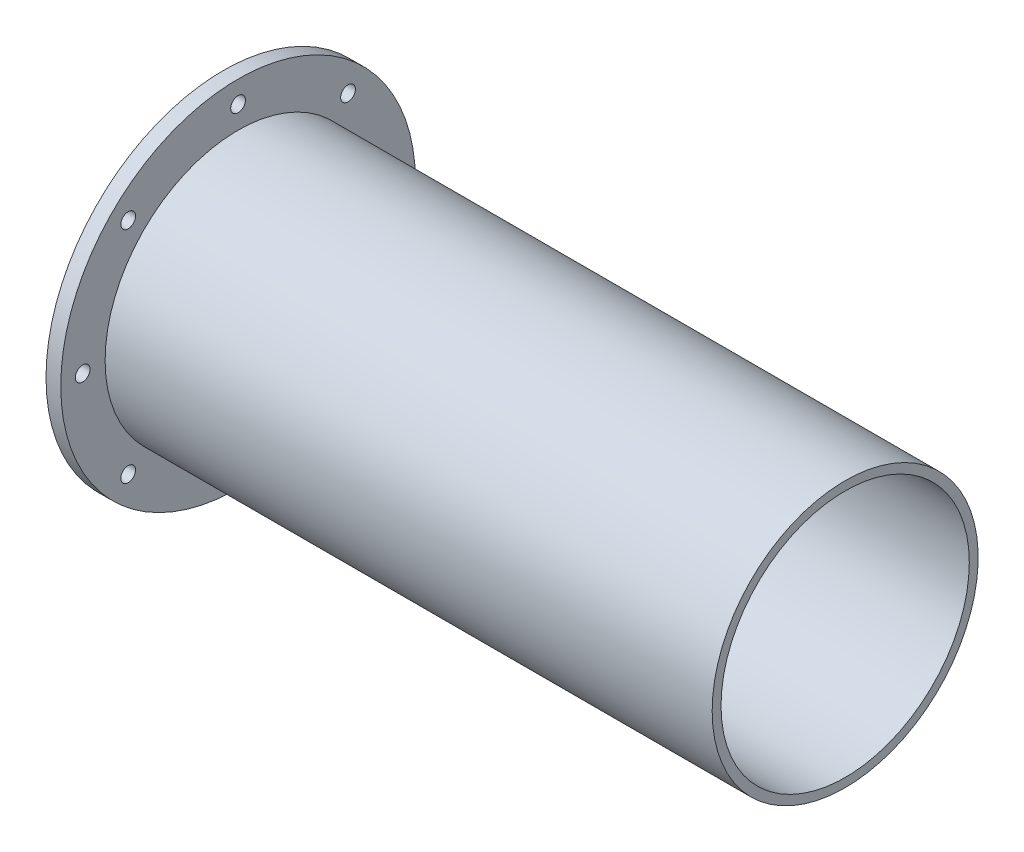
ISO-10303-21;
HEADER;
FILE_DESCRIPTION(('STEP AP214'),'2;1');
FILE_NAME('part.step','',(''),(''),'','','');
FILE_SCHEMA(('AUTOMOTIVE_DESIGN { 1 0 10303 214 1 1 1 1 }'));
ENDSEC;
DATA;
#1=APPLICATION_CONTEXT('core data for automotive mechanical design processes');
#2=APPLICATION_PROTOCOL_DEFINITION('international standard','automotive_design',2000,#1);
#3=PRODUCT_CONTEXT('',#1,'mechanical');
#4=PRODUCT('Part','Part','',(#3));
#5=PRODUCT_RELATED_PRODUCT_CATEGORY('part','',(#4));
#6=PRODUCT_DEFINITION_FORMATION('','',#4);
#7=PRODUCT_DEFINITION_CONTEXT('part definition',#1,'design');
#8=PRODUCT_DEFINITION('design','',#6,#7);
#9=PRODUCT_DEFINITION_SHAPE('','',#8);
#10=(LENGTH_UNIT() NAMED_UNIT(*) SI_UNIT(.MILLI.,.METRE.));
#11=(NAMED_UNIT(*) PLANE_ANGLE_UNIT() SI_UNIT($,.RADIAN.));
#12=(NAMED_UNIT(*) SI_UNIT($,.STERADIAN.) SOLID_ANGLE_UNIT());
#13=UNCERTAINTY_MEASURE_WITH_UNIT(LENGTH_MEASURE(1.E-05),#10,'distance_accuracy_value','');
#14=(GEOMETRIC_REPRESENTATION_CONTEXT(3) GLOBAL_UNCERTAINTY_ASSIGNED_CONTEXT((#13)) GLOBAL_UNIT_ASSIGNED_CONTEXT((#10,
#11,#12)) REPRESENTATION_CONTEXT('',''));
#15=CARTESIAN_POINT('',(0.,0.,0.));
#16=DIRECTION('',(0.,0.,1.));
#17=DIRECTION('',(1.,0.,0.));
#18=AXIS2_PLACEMENT_3D('',#15,#16,#17);
#19=CARTESIAN_POINT('',(0.,76.2,0.));
#20=DIRECTION('',(1.,0.,0.));
#21=DIRECTION('',(0.,0.,-1.));
#22=AXIS2_PLACEMENT_3D('',#19,#20,#21);
#23=PLANE('',#22);
#24=CARTESIAN_POINT('',(0.,-66.802,2.33237936397399E-13));
#25=DIRECTION('',(1.,0.,0.));
#26=DIRECTION('',(0.,-1.,0.));
#27=AXIS2_PLACEMENT_3D('',#24,#25,#26);
#28=CIRCLE('',#27,3.175);
#29=CARTESIAN_POINT('',(0.,-69.977,2.44323389648226E-13));
#30=VERTEX_POINT('',#29);
#31=EDGE_CURVE('E71',#30,#30,#28,.T.);
#32=ORIENTED_EDGE('',*,*,#31,.T.);
#33=EDGE_LOOP('',(#32));
#34=FACE_BOUND('',#33,.T.);
#35=CARTESIAN_POINT('',(0.,-47.2361471968235,47.236147196824));
#36=DIRECTION('',(1.,0.,0.));
#37=DIRECTION('',(0.,-0.707106781186544,0.707106781186551));
#38=AXIS2_PLACEMENT_3D('',#35,#36,#37);
#39=CIRCLE('',#38,3.175);
#40=CARTESIAN_POINT('',(0.,-49.4812112270908,49.4812112270913));
#41=VERTEX_POINT('',#40);
#42=EDGE_CURVE('E90',#41,#41,#39,.T.);
#43=ORIENTED_EDGE('',*,*,#42,.T.);
#44=EDGE_LOOP('',(#43));
#45=FACE_BOUND('',#44,.T.);
#46=CARTESIAN_POINT('',(0.,0.,66.802));
#47=DIRECTION('',(1.,0.,0.));
#48=DIRECTION('',(0.,0.,1.));
#49=AXIS2_PLACEMENT_3D('',#46,#47,#48);
#50=CIRCLE('',#49,3.175);
#51=CARTESIAN_POINT('',(0.,0.,69.977));
#52=VERTEX_POINT('',#51);
#53=EDGE_CURVE('E84',#52,#52,#50,.T.);
#54=ORIENTED_EDGE('',*,*,#53,.T.);
#55=EDGE_LOOP('',(#54));
#56=FACE_BOUND('',#55,.T.);
#57=CARTESIAN_POINT('',(0.,47.2361471968242,47.2361471968233));
#58=DIRECTION('',(1.,0.,0.));
#59=DIRECTION('',(0.,0.707106781186554,0.707106781186541));
#60=AXIS2_PLACEMENT_3D('',#57,#58,#59);
#61=CIRCLE('',#60,3.175);
#62=CARTESIAN_POINT('',(0.,49.4812112270915,49.4812112270906));
#63=VERTEX_POINT('',#62);
#64=EDGE_CURVE('E77',#63,#63,#61,.T.);
#65=ORIENTED_EDGE('',*,*,#64,.T.);
#66=EDGE_LOOP('',(#65));
#67=FACE_BOUND('',#66,.T.);
#68=CARTESIAN_POINT('',(0.,66.802,-6.99713809192197E-13));
#69=DIRECTION('',(1.,0.,0.));
#70=DIRECTION('',(0.,1.,0.));
#71=AXIS2_PLACEMENT_3D('',#68,#69,#70);
#72=CIRCLE('',#71,3.175);
#73=CARTESIAN_POINT('',(0.,69.977,-7.32970168944678E-13));
#74=VERTEX_POINT('',#73);
#75=EDGE_CURVE('E78',#74,#74,#72,.T.);
#76=ORIENTED_EDGE('',*,*,#75,.T.);
#77=EDGE_LOOP('',(#76));
#78=FACE_BOUND('',#77,.T.);
#79=CARTESIAN_POINT('',(0.,47.2361471968232,-47.2361471968243));
#80=DIRECTION('',(1.,0.,0.));
#81=DIRECTION('',(0.,0.707106781186539,-0.707106781186556));
#82=AXIS2_PLACEMENT_3D('',#79,#80,#81);
#83=CIRCLE('',#82,3.175);
#84=CARTESIAN_POINT('',(0.,49.4812112270904,-49.4812112270916));
#85=VERTEX_POINT('',#84);
#86=EDGE_CURVE('E101',#85,#85,#83,.T.);
#87=ORIENTED_EDGE('',*,*,#86,.T.);
#88=EDGE_LOOP('',(#87));
#89=FACE_BOUND('',#88,.T.);
#90=CARTESIAN_POINT('',(0.,-47.2361471968238,-47.2361471968237));
#91=DIRECTION('',(1.,0.,0.));
#92=DIRECTION('',(0.,-0.707106781186549,-0.707106781186546));
#93=AXIS2_PLACEMENT_3D('',#90,#91,#92);
#94=CIRCLE('',#93,3.175);
#95=CARTESIAN_POINT('',(0.,-49.4812112270911,-49.481211227091));
#96=VERTEX_POINT('',#95);
#97=EDGE_CURVE('E65',#96,#96,#94,.T.);
#98=ORIENTED_EDGE('',*,*,#97,.T.);
#99=EDGE_LOOP('',(#98));
#100=FACE_BOUND('',#99,.T.);
#101=CARTESIAN_POINT('',(0.,0.,-66.802));
#102=DIRECTION('',(1.,0.,0.));
#103=DIRECTION('',(0.,0.,-1.));
#104=AXIS2_PLACEMENT_3D('',#101,#102,#103);
#105=CIRCLE('',#104,3.175);
#106=CARTESIAN_POINT('',(0.,0.,-69.977));
#107=VERTEX_POINT('',#106);
#108=EDGE_CURVE('E61',#107,#107,#105,.T.);
#109=ORIENTED_EDGE('',*,*,#108,.T.);
#110=EDGE_LOOP('',(#109));
#111=FACE_BOUND('',#110,.T.);
#112=CARTESIAN_POINT('',(0.,0.,0.));
#113=DIRECTION('',(-1.,0.,0.));
#114=DIRECTION('',(0.,0.,1.));
#115=AXIS2_PLACEMENT_3D('',#112,#113,#114);
#116=CIRCLE('',#115,53.34);
#117=CARTESIAN_POINT('',(0.,0.,53.34));
#118=VERTEX_POINT('',#117);
#119=EDGE_CURVE('E58',#118,#118,#116,.T.);
#120=ORIENTED_EDGE('',*,*,#119,.F.);
#121=EDGE_LOOP('',(#120));
#122=FACE_BOUND('',#121,.T.);
#123=CARTESIAN_POINT('',(0.,0.,0.));
#124=DIRECTION('',(-1.,0.,0.));
#125=DIRECTION('',(0.,0.,1.));
#126=AXIS2_PLACEMENT_3D('',#123,#124,#125);
#127=CIRCLE('',#126,76.2);
#128=CARTESIAN_POINT('',(0.,0.,76.2));
#129=VERTEX_POINT('',#128);
#130=EDGE_CURVE('E10',#129,#129,#127,.T.);
#131=ORIENTED_EDGE('',*,*,#130,.T.);
#132=EDGE_LOOP('',(#131));
#133=FACE_BOUND('',#132,.T.);
#134=ADVANCED_FACE('F36',(#34,#45,#56,#67,#78,#89,#100,#111,#122,#133),#23,.F.);
#135=CARTESIAN_POINT('',(0.,0.,0.));
#136=DIRECTION('',(-1.,0.,0.));
#137=DIRECTION('',(0.,0.,1.));
#138=AXIS2_PLACEMENT_3D('',#135,#136,#137);
#139=CYLINDRICAL_SURFACE('',#138,76.2);
#140=ORIENTED_EDGE('',*,*,#130,.F.);
#141=EDGE_LOOP('',(#140));
#142=FACE_BOUND('',#141,.T.);
#143=CARTESIAN_POINT('',(6.35000000000001,0.,0.));
#144=DIRECTION('',(-1.,0.,0.));
#145=DIRECTION('',(0.,0.,1.));
#146=AXIS2_PLACEMENT_3D('',#143,#144,#145);
#147=CIRCLE('',#146,76.2);
#148=CARTESIAN_POINT('',(6.35000000000001,0.,76.2));
#149=VERTEX_POINT('',#148);
#150=EDGE_CURVE('E42',#149,#149,#147,.T.);
#151=ORIENTED_EDGE('',*,*,#150,.T.);
#152=EDGE_LOOP('',(#151));
#153=FACE_BOUND('',#152,.T.);
#154=ADVANCED_FACE('F124',(#142,#153),#139,.T.);
#155=CARTESIAN_POINT('',(6.35,76.2,0.));
#156=DIRECTION('',(-1.,0.,0.));
#157=DIRECTION('',(0.,0.,1.));
#158=AXIS2_PLACEMENT_3D('',#155,#156,#157);
#159=PLANE('',#158);
#160=CARTESIAN_POINT('',(6.35,-66.802,2.33237936397399E-13));
#161=DIRECTION('',(1.,0.,0.));
#162=DIRECTION('',(0.,-1.,0.));
#163=AXIS2_PLACEMENT_3D('',#160,#161,#162);
#164=CIRCLE('',#163,3.175);
#165=CARTESIAN_POINT('',(6.35,-69.977,2.44323389648226E-13));
#166=VERTEX_POINT('',#165);
#167=EDGE_CURVE('E93',#166,#166,#164,.T.);
#168=ORIENTED_EDGE('',*,*,#167,.F.);
#169=EDGE_LOOP('',(#168));
#170=FACE_BOUND('',#169,.T.);
#171=CARTESIAN_POINT('',(6.35,-47.2361471968235,47.236147196824));
#172=DIRECTION('',(1.,0.,0.));
#173=DIRECTION('',(0.,-0.707106781186544,0.707106781186551));
#174=AXIS2_PLACEMENT_3D('',#171,#172,#173);
#175=CIRCLE('',#174,3.175);
#176=CARTESIAN_POINT('',(6.35,-49.4812112270908,49.4812112270913));
#177=VERTEX_POINT('',#176);
#178=EDGE_CURVE('E87',#177,#177,#175,.T.);
#179=ORIENTED_EDGE('',*,*,#178,.F.);
#180=EDGE_LOOP('',(#179));
#181=FACE_BOUND('',#180,.T.);
#182=CARTESIAN_POINT('',(6.35,0.,66.802));
#183=DIRECTION('',(1.,0.,0.));
#184=DIRECTION('',(0.,0.,1.));
#185=AXIS2_PLACEMENT_3D('',#182,#183,#184);
#186=CIRCLE('',#185,3.175);
#187=CARTESIAN_POINT('',(6.35,0.,69.977));
#188=VERTEX_POINT('',#187);
#189=EDGE_CURVE('E81',#188,#188,#186,.T.);
#190=ORIENTED_EDGE('',*,*,#189,.F.);
#191=EDGE_LOOP('',(#190));
#192=FACE_BOUND('',#191,.T.);
#193=CARTESIAN_POINT('',(6.35,47.2361471968242,47.2361471968233));
#194=DIRECTION('',(1.,0.,0.));
#195=DIRECTION('',(0.,0.707106781186554,0.707106781186541));
#196=AXIS2_PLACEMENT_3D('',#193,#194,#195);
#197=CIRCLE('',#196,3.175);
#198=CARTESIAN_POINT('',(6.35,49.4812112270915,49.4812112270906));
#199=VERTEX_POINT('',#198);
#200=EDGE_CURVE('E74',#199,#199,#197,.T.);
#201=ORIENTED_EDGE('',*,*,#200,.F.);
#202=EDGE_LOOP('',(#201));
#203=FACE_BOUND('',#202,.T.);
#204=CARTESIAN_POINT('',(6.35,66.802,-6.99713809192197E-13));
#205=DIRECTION('',(1.,0.,0.));
#206=DIRECTION('',(0.,1.,0.));
#207=AXIS2_PLACEMENT_3D('',#204,#205,#206);
#208=CIRCLE('',#207,3.175);
#209=CARTESIAN_POINT('',(6.35,69.977,-7.32970168944678E-13));
#210=VERTEX_POINT('',#209);
#211=EDGE_CURVE('E104',#210,#210,#208,.T.);
#212=ORIENTED_EDGE('',*,*,#211,.F.);
#213=EDGE_LOOP('',(#212));
#214=FACE_BOUND('',#213,.T.);
#215=CARTESIAN_POINT('',(6.35,47.2361471968232,-47.2361471968243));
#216=DIRECTION('',(1.,0.,0.));
#217=DIRECTION('',(0.,0.707106781186539,-0.707106781186556));
#218=AXIS2_PLACEMENT_3D('',#215,#216,#217);
#219=CIRCLE('',#218,3.175);
#220=CARTESIAN_POINT('',(6.35,49.4812112270904,-49.4812112270916));
#221=VERTEX_POINT('',#220);
#222=EDGE_CURVE('E98',#221,#221,#219,.T.);
#223=ORIENTED_EDGE('',*,*,#222,.F.);
#224=EDGE_LOOP('',(#223));
#225=FACE_BOUND('',#224,.T.);
#226=CARTESIAN_POINT('',(6.35,-47.2361471968238,-47.2361471968237));
#227=DIRECTION('',(1.,0.,0.));
#228=DIRECTION('',(0.,-0.707106781186549,-0.707106781186546));
#229=AXIS2_PLACEMENT_3D('',#226,#227,#228);
#230=CIRCLE('',#229,3.175);
#231=CARTESIAN_POINT('',(6.35,-49.4812112270911,-49.481211227091));
#232=VERTEX_POINT('',#231);
#233=EDGE_CURVE('E68',#232,#232,#230,.T.);
#234=ORIENTED_EDGE('',*,*,#233,.F.);
#235=EDGE_LOOP('',(#234));
#236=FACE_BOUND('',#235,.T.);
#237=CARTESIAN_POINT('',(6.35,0.,-66.802));
#238=DIRECTION('',(1.,0.,0.));
#239=DIRECTION('',(0.,0.,-1.));
#240=AXIS2_PLACEMENT_3D('',#237,#238,#239);
#241=CIRCLE('',#240,3.175);
#242=CARTESIAN_POINT('',(6.35,0.,-69.977));
#243=VERTEX_POINT('',#242);
#244=EDGE_CURVE('E62',#243,#243,#241,.T.);
#245=ORIENTED_EDGE('',*,*,#244,.F.);
#246=EDGE_LOOP('',(#245));
#247=FACE_BOUND('',#246,.T.);
#248=ORIENTED_EDGE('',*,*,#150,.F.);
#249=EDGE_LOOP('',(#248));
#250=FACE_BOUND('',#249,.T.);
#251=CARTESIAN_POINT('',(6.35,0.,0.));
#252=DIRECTION('',(-1.,0.,0.));
#253=DIRECTION('',(0.,0.,1.));
#254=AXIS2_PLACEMENT_3D('',#251,#252,#253);
#255=CIRCLE('',#254,57.15);
#256=CARTESIAN_POINT('',(6.35,0.,57.15));
#257=VERTEX_POINT('',#256);
#258=EDGE_CURVE('E46',#257,#257,#255,.T.);
#259=ORIENTED_EDGE('',*,*,#258,.T.);
#260=EDGE_LOOP('',(#259));
#261=FACE_BOUND('',#260,.T.);
#262=ADVANCED_FACE('F120',(#170,#181,#192,#203,#214,#225,#236,#247,#250,#261),#159,.F.);
#263=CARTESIAN_POINT('',(0.,0.,0.));
#264=DIRECTION('',(-1.,0.,0.));
#265=DIRECTION('',(0.,0.,1.));
#266=AXIS2_PLACEMENT_3D('',#263,#264,#265);
#267=CYLINDRICAL_SURFACE('',#266,57.15);
#268=ORIENTED_EDGE('',*,*,#258,.F.);
#269=EDGE_LOOP('',(#268));
#270=FACE_BOUND('',#269,.T.);
#271=CARTESIAN_POINT('',(267.208,0.,0.));
#272=DIRECTION('',(-1.,0.,0.));
#273=DIRECTION('',(0.,0.,1.));
#274=AXIS2_PLACEMENT_3D('',#271,#272,#273);
#275=CIRCLE('',#274,57.15);
#276=CARTESIAN_POINT('',(267.208,0.,57.15));
#277=VERTEX_POINT('',#276);
#278=EDGE_CURVE('E50',#277,#277,#275,.T.);
#279=ORIENTED_EDGE('',*,*,#278,.T.);
#280=EDGE_LOOP('',(#279));
#281=FACE_BOUND('',#280,.T.);
#282=ADVANCED_FACE('F123',(#270,#281),#267,.T.);
#283=CARTESIAN_POINT('',(267.208,57.15,0.));
#284=DIRECTION('',(-1.,0.,0.));
#285=DIRECTION('',(0.,0.,1.));
#286=AXIS2_PLACEMENT_3D('',#283,#284,#285);
#287=PLANE('',#286);
#288=ORIENTED_EDGE('',*,*,#278,.F.);
#289=EDGE_LOOP('',(#288));
#290=FACE_BOUND('',#289,.T.);
#291=CARTESIAN_POINT('',(267.208,0.,0.));
#292=DIRECTION('',(-1.,0.,0.));
#293=DIRECTION('',(0.,0.,1.));
#294=AXIS2_PLACEMENT_3D('',#291,#292,#293);
#295=CIRCLE('',#294,53.34);
#296=CARTESIAN_POINT('',(267.208,0.,53.34));
#297=VERTEX_POINT('',#296);
#298=EDGE_CURVE('E55',#297,#297,#295,.T.);
#299=ORIENTED_EDGE('',*,*,#298,.T.);
#300=EDGE_LOOP('',(#299));
#301=FACE_BOUND('',#300,.T.);
#302=ADVANCED_FACE('F138',(#290,#301),#287,.F.);
#303=CARTESIAN_POINT('',(0.,0.,0.));
#304=DIRECTION('',(-1.,0.,0.));
#305=DIRECTION('',(0.,0.,1.));
#306=AXIS2_PLACEMENT_3D('',#303,#304,#305);
#307=CYLINDRICAL_SURFACE('',#306,53.34);
#308=ORIENTED_EDGE('',*,*,#298,.F.);
#309=EDGE_LOOP('',(#308));
#310=FACE_BOUND('',#309,.T.);
#311=ORIENTED_EDGE('',*,*,#119,.T.);
#312=EDGE_LOOP('',(#311));
#313=FACE_BOUND('',#312,.T.);
#314=ADVANCED_FACE('F144',(#310,#313),#307,.F.);
#315=CARTESIAN_POINT('',(0.,0.,-66.802));
#316=DIRECTION('',(1.,0.,0.));
#317=DIRECTION('',(0.,0.,-1.));
#318=AXIS2_PLACEMENT_3D('',#315,#316,#317);
#319=CYLINDRICAL_SURFACE('',#318,3.175);
#320=ORIENTED_EDGE('',*,*,#108,.F.);
#321=EDGE_LOOP('',(#320));
#322=FACE_BOUND('',#321,.T.);
#323=ORIENTED_EDGE('',*,*,#244,.T.);
#324=EDGE_LOOP('',(#323));
#325=FACE_BOUND('',#324,.T.);
#326=ADVANCED_FACE('F150',(#322,#325),#319,.F.);
#327=CARTESIAN_POINT('',(0.,-47.2361471968238,-47.2361471968237));
#328=DIRECTION('',(1.,0.,0.));
#329=DIRECTION('',(0.,0.,-1.));
#330=AXIS2_PLACEMENT_3D('',#327,#328,#329);
#331=CYLINDRICAL_SURFACE('',#330,3.175);
#332=ORIENTED_EDGE('',*,*,#97,.F.);
#333=EDGE_LOOP('',(#332));
#334=FACE_BOUND('',#333,.T.);
#335=ORIENTED_EDGE('',*,*,#233,.T.);
#336=EDGE_LOOP('',(#335));
#337=FACE_BOUND('',#336,.T.);
#338=ADVANCED_FACE('F182',(#334,#337),#331,.F.);
#339=CARTESIAN_POINT('',(0.,47.2361471968232,-47.2361471968243));
#340=DIRECTION('',(1.,0.,0.));
#341=DIRECTION('',(0.,0.,-1.));
#342=AXIS2_PLACEMENT_3D('',#339,#340,#341);
#343=CYLINDRICAL_SURFACE('',#342,3.175);
#344=ORIENTED_EDGE('',*,*,#86,.F.);
#345=EDGE_LOOP('',(#344));
#346=FACE_BOUND('',#345,.T.);
#347=ORIENTED_EDGE('',*,*,#222,.T.);
#348=EDGE_LOOP('',(#347));
#349=FACE_BOUND('',#348,.T.);
#350=ADVANCED_FACE('F116',(#346,#349),#343,.F.);
#351=CARTESIAN_POINT('',(0.,66.802,-6.99713809192197E-13));
#352=DIRECTION('',(1.,0.,0.));
#353=DIRECTION('',(0.,0.,-1.));
#354=AXIS2_PLACEMENT_3D('',#351,#352,#353);
#355=CYLINDRICAL_SURFACE('',#354,3.175);
#356=ORIENTED_EDGE('',*,*,#75,.F.);
#357=EDGE_LOOP('',(#356));
#358=FACE_BOUND('',#357,.T.);
#359=ORIENTED_EDGE('',*,*,#211,.T.);
#360=EDGE_LOOP('',(#359));
#361=FACE_BOUND('',#360,.T.);
#362=ADVANCED_FACE('F112',(#358,#361),#355,.F.);
#363=CARTESIAN_POINT('',(0.,47.2361471968242,47.2361471968233));
#364=DIRECTION('',(1.,0.,0.));
#365=DIRECTION('',(0.,0.,-1.));
#366=AXIS2_PLACEMENT_3D('',#363,#364,#365);
#367=CYLINDRICAL_SURFACE('',#366,3.175);
#368=ORIENTED_EDGE('',*,*,#64,.F.);
#369=EDGE_LOOP('',(#368));
#370=FACE_BOUND('',#369,.T.);
#371=ORIENTED_EDGE('',*,*,#200,.T.);
#372=EDGE_LOOP('',(#371));
#373=FACE_BOUND('',#372,.T.);
#374=ADVANCED_FACE('F115',(#370,#373),#367,.F.);
#375=CARTESIAN_POINT('',(0.,0.,66.802));
#376=DIRECTION('',(1.,0.,0.));
#377=DIRECTION('',(0.,0.,-1.));
#378=AXIS2_PLACEMENT_3D('',#375,#376,#377);
#379=CYLINDRICAL_SURFACE('',#378,3.175);
#380=ORIENTED_EDGE('',*,*,#53,.F.);
#381=EDGE_LOOP('',(#380));
#382=FACE_BOUND('',#381,.T.);
#383=ORIENTED_EDGE('',*,*,#189,.T.);
#384=EDGE_LOOP('',(#383));
#385=FACE_BOUND('',#384,.T.);
#386=ADVANCED_FACE('F170',(#382,#385),#379,.F.);
#387=CARTESIAN_POINT('',(0.,-47.2361471968235,47.236147196824));
#388=DIRECTION('',(1.,0.,0.));
#389=DIRECTION('',(0.,0.,-1.));
#390=AXIS2_PLACEMENT_3D('',#387,#388,#389);
#391=CYLINDRICAL_SURFACE('',#390,3.175);
#392=ORIENTED_EDGE('',*,*,#42,.F.);
#393=EDGE_LOOP('',(#392));
#394=FACE_BOUND('',#393,.T.);
#395=ORIENTED_EDGE('',*,*,#178,.T.);
#396=EDGE_LOOP('',(#395));
#397=FACE_BOUND('',#396,.T.);
#398=ADVANCED_FACE('F177',(#394,#397),#391,.F.);
#399=CARTESIAN_POINT('',(0.,-66.802,2.33237936397399E-13));
#400=DIRECTION('',(1.,0.,0.));
#401=DIRECTION('',(0.,0.,-1.));
#402=AXIS2_PLACEMENT_3D('',#399,#400,#401);
#403=CYLINDRICAL_SURFACE('',#402,3.175);
#404=ORIENTED_EDGE('',*,*,#31,.F.);
#405=EDGE_LOOP('',(#404));
#406=FACE_BOUND('',#405,.T.);
#407=ORIENTED_EDGE('',*,*,#167,.T.);
#408=EDGE_LOOP('',(#407));
#409=FACE_BOUND('',#408,.T.);
#410=ADVANCED_FACE('F230',(#406,#409),#403,.F.);
#411=CLOSED_SHELL('',(#134,#154,#262,#282,#302,#314,#326,#338,#350,#362,#374,#386,#398,#410));
#412=MANIFOLD_SOLID_BREP('B2',#411);
#413=ADVANCED_BREP_SHAPE_REPRESENTATION('',(#18,#412),#14);
#414=SHAPE_DEFINITION_REPRESENTATION(#9,#413);
ENDSEC;
END-ISO-10303-21;
